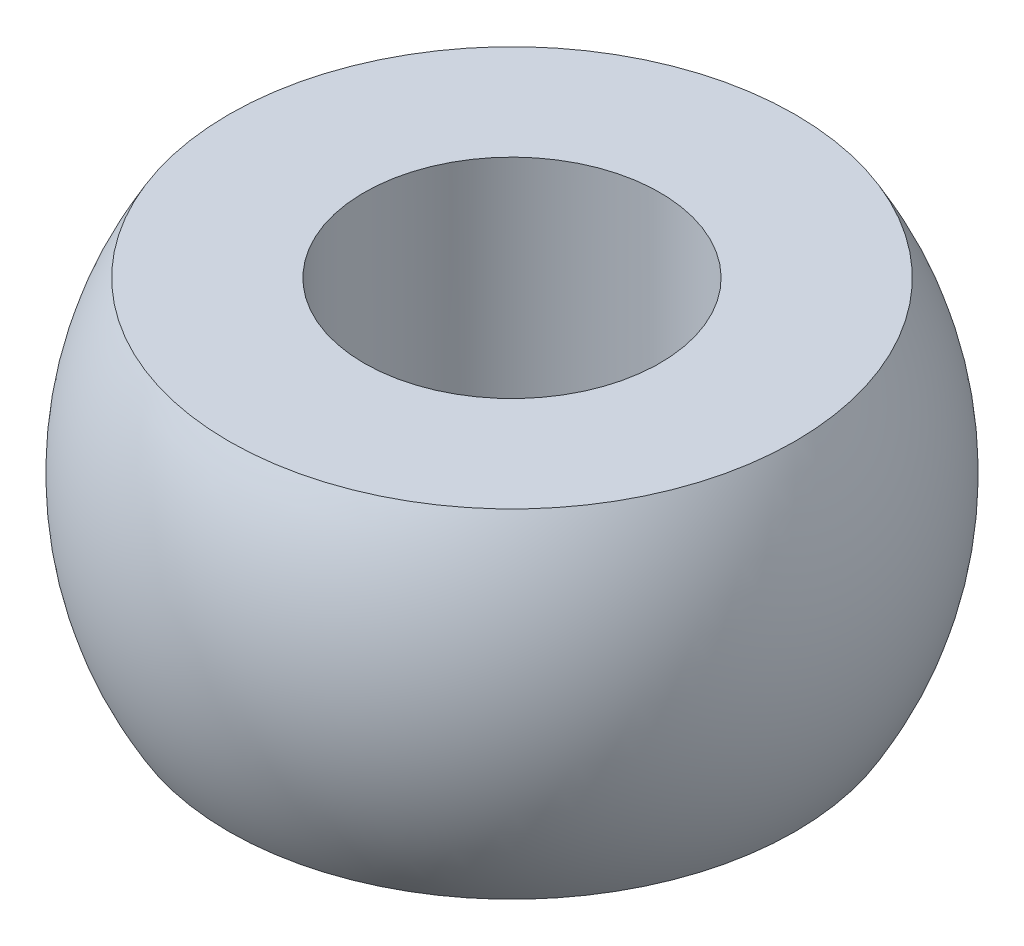
ISO-10303-21;
HEADER;
FILE_DESCRIPTION(('STEP AP214'),'2;1');
FILE_NAME('part.step','',(''),(''),'','','');
FILE_SCHEMA(('AUTOMOTIVE_DESIGN { 1 0 10303 214 1 1 1 1 }'));
ENDSEC;
DATA;
#1=APPLICATION_CONTEXT('core data for automotive mechanical design processes');
#2=APPLICATION_PROTOCOL_DEFINITION('international standard','automotive_design',2000,#1);
#3=PRODUCT_CONTEXT('',#1,'mechanical');
#4=PRODUCT('Part','Part','',(#3));
#5=PRODUCT_RELATED_PRODUCT_CATEGORY('part','',(#4));
#6=PRODUCT_DEFINITION_FORMATION('','',#4);
#7=PRODUCT_DEFINITION_CONTEXT('part definition',#1,'design');
#8=PRODUCT_DEFINITION('design','',#6,#7);
#9=PRODUCT_DEFINITION_SHAPE('','',#8);
#10=(LENGTH_UNIT() NAMED_UNIT(*) SI_UNIT(.MILLI.,.METRE.));
#11=(NAMED_UNIT(*) PLANE_ANGLE_UNIT() SI_UNIT($,.RADIAN.));
#12=(NAMED_UNIT(*) SI_UNIT($,.STERADIAN.) SOLID_ANGLE_UNIT());
#13=UNCERTAINTY_MEASURE_WITH_UNIT(LENGTH_MEASURE(1.E-05),#10,'distance_accuracy_value','');
#14=(GEOMETRIC_REPRESENTATION_CONTEXT(3) GLOBAL_UNCERTAINTY_ASSIGNED_CONTEXT((#13)) GLOBAL_UNIT_ASSIGNED_CONTEXT((#10,
#11,#12)) REPRESENTATION_CONTEXT('',''));
#15=CARTESIAN_POINT('',(0.,0.,0.));
#16=DIRECTION('',(0.,0.,1.));
#17=DIRECTION('',(1.,0.,0.));
#18=AXIS2_PLACEMENT_3D('',#15,#16,#17);
#19=CARTESIAN_POINT('',(0.,2.,0.));
#20=DIRECTION('',(0.,1.,0.));
#21=DIRECTION('',(0.,0.,1.));
#22=AXIS2_PLACEMENT_3D('',#19,#20,#21);
#23=PLANE('',#22);
#24=CARTESIAN_POINT('',(0.,2.,0.));
#25=DIRECTION('',(0.,1.,0.));
#26=DIRECTION('',(0.,0.,1.));
#27=AXIS2_PLACEMENT_3D('',#24,#25,#26);
#28=CIRCLE('',#27,1.75);
#29=CARTESIAN_POINT('',(0.,2.,1.75));
#30=VERTEX_POINT('',#29);
#31=EDGE_CURVE('E53',#30,#30,#28,.T.);
#32=ORIENTED_EDGE('',*,*,#31,.F.);
#33=EDGE_LOOP('',(#32));
#34=FACE_BOUND('',#33,.T.);
#35=CARTESIAN_POINT('',(0.,2.,0.));
#36=DIRECTION('',(0.,1.,0.));
#37=DIRECTION('',(0.,0.,1.));
#38=AXIS2_PLACEMENT_3D('',#35,#36,#37);
#39=CIRCLE('',#38,3.35);
#40=CARTESIAN_POINT('',(0.,2.,3.35));
#41=VERTEX_POINT('',#40);
#42=EDGE_CURVE('E10',#41,#41,#39,.T.);
#43=ORIENTED_EDGE('',*,*,#42,.T.);
#44=EDGE_LOOP('',(#43));
#45=FACE_BOUND('',#44,.T.);
#46=ADVANCED_FACE('F41',(#34,#45),#23,.T.);
#47=CARTESIAN_POINT('',(0.,0.,0.));
#48=DIRECTION('',(0.,1.,0.));
#49=DIRECTION('',(0.,0.,1.));
#50=AXIS2_PLACEMENT_3D('',#47,#48,#49);
#51=SPHERICAL_SURFACE('',#50,3.90160223497988);
#52=CARTESIAN_POINT('',(0.,-2.,0.));
#53=DIRECTION('',(0.,1.,0.));
#54=DIRECTION('',(0.,0.,1.));
#55=AXIS2_PLACEMENT_3D('',#52,#53,#54);
#56=CIRCLE('',#55,3.35);
#57=CARTESIAN_POINT('',(0.,-2.,3.35));
#58=VERTEX_POINT('',#57);
#59=EDGE_CURVE('E48',#58,#58,#56,.T.);
#60=CARTESIAN_POINT('',(0.,-2.,3.35));
#61=CARTESIAN_POINT('',(0.,-1.96243675523189,3.37242616582447));
#62=CARTESIAN_POINT('',(0.,-1.92449603362986,3.39422002397197));
#63=CARTESIAN_POINT('',(0.,-1.84790320020827,3.43651961537438));
#64=CARTESIAN_POINT('',(0.,-1.80925108838871,3.4570253486293));
#65=CARTESIAN_POINT('',(0.,-1.73127903798243,3.49672518070796));
#66=CARTESIAN_POINT('',(0.,-1.69195909939571,3.51591927953169));
#67=CARTESIAN_POINT('',(0.,-1.61269593020469,3.55297420780682));
#68=CARTESIAN_POINT('',(0.,-1.57275269960039,3.57083503725822));
#69=CARTESIAN_POINT('',(0.,-1.49228812856731,3.60520319575483));
#70=CARTESIAN_POINT('',(0.,-1.45176678813853,3.62171052480005));
#71=CARTESIAN_POINT('',(0.,-1.37019184924601,3.65335301092874));
#72=CARTESIAN_POINT('',(0.,-1.32913825078226,3.66848816801221));
#73=CARTESIAN_POINT('',(0.,-1.246545245692,3.69736918371475));
#74=CARTESIAN_POINT('',(0.,-1.20500583906549,3.71111504233382));
#75=CARTESIAN_POINT('',(0.,-1.12148821830909,3.73720190856192));
#76=CARTESIAN_POINT('',(0.,-1.07951000417919,3.74954291617094));
#77=CARTESIAN_POINT('',(0.,-0.995162265273221,3.77280611683498));
#78=CARTESIAN_POINT('',(0.,-0.952792740497156,3.78372830989));
#79=CARTESIAN_POINT('',(0.,-0.867710319990576,3.80414152338697));
#80=CARTESIAN_POINT('',(0.,-0.824997424260063,3.81363254382893));
#81=CARTESIAN_POINT('',(0.,-0.739276590027465,3.83117267332506));
#82=CARTESIAN_POINT('',(0.,-0.696268651525381,3.83922178237924));
#83=CARTESIAN_POINT('',(0.,-0.610006393769101,3.85386898180916));
#84=CARTESIAN_POINT('',(0.,-0.566752074514905,3.8604670721849));
#85=CARTESIAN_POINT('',(0.,-0.480045996043757,3.8722047687427));
#86=CARTESIAN_POINT('',(0.,-0.436594236826805,3.87734437492477));
#87=CARTESIAN_POINT('',(0.,-0.349542442616511,3.88615928780598));
#88=CARTESIAN_POINT('',(0.,-0.305942407623169,3.88983459450512));
#89=CARTESIAN_POINT('',(0.,-0.21864339381534,3.89571674993601));
#90=CARTESIAN_POINT('',(0.,-0.174944415000853,3.89792359866777));
#91=CARTESIAN_POINT('',(0.,-0.0874969574575782,3.9008663411897));
#92=CARTESIAN_POINT('',(0.,-0.0437484787287895,3.90160223497988));
#93=CARTESIAN_POINT('',(0.,0.0437484787287877,3.90160223497988));
#94=CARTESIAN_POINT('',(0.,0.0874969574575764,3.9008663411897));
#95=CARTESIAN_POINT('',(0.,0.174944415000851,3.89792359866777));
#96=CARTESIAN_POINT('',(0.,0.218643393815338,3.89571674993601));
#97=CARTESIAN_POINT('',(0.,0.305942407623167,3.88983459450512));
#98=CARTESIAN_POINT('',(0.,0.349542442616509,3.88615928780598));
#99=CARTESIAN_POINT('',(0.,0.436594236826803,3.87734437492477));
#100=CARTESIAN_POINT('',(0.,0.480045996043755,3.8722047687427));
#101=CARTESIAN_POINT('',(0.,0.566752074514903,3.8604670721849));
#102=CARTESIAN_POINT('',(0.,0.610006393769099,3.85386898180916));
#103=CARTESIAN_POINT('',(0.,0.69626865152538,3.83922178237924));
#104=CARTESIAN_POINT('',(0.,0.739276590027464,3.83117267332506));
#105=CARTESIAN_POINT('',(0.,0.824997424260062,3.81363254382893));
#106=CARTESIAN_POINT('',(0.,0.867710319990575,3.80414152338697));
#107=CARTESIAN_POINT('',(0.,0.952792740497154,3.78372830989));
#108=CARTESIAN_POINT('',(0.,0.99516226527322,3.77280611683498));
#109=CARTESIAN_POINT('',(0.,1.07951000417918,3.74954291617094));
#110=CARTESIAN_POINT('',(0.,1.12148821830908,3.73720190856192));
#111=CARTESIAN_POINT('',(0.,1.20500583906549,3.71111504233382));
#112=CARTESIAN_POINT('',(0.,1.246545245692,3.69736918371475));
#113=CARTESIAN_POINT('',(0.,1.32913825078226,3.66848816801221));
#114=CARTESIAN_POINT('',(0.,1.370191849246,3.65335301092874));
#115=CARTESIAN_POINT('',(0.,1.45176678813853,3.62171052480005));
#116=CARTESIAN_POINT('',(0.,1.49228812856731,3.60520319575483));
#117=CARTESIAN_POINT('',(0.,1.57275269960039,3.57083503725822));
#118=CARTESIAN_POINT('',(0.,1.61269593020469,3.55297420780682));
#119=CARTESIAN_POINT('',(0.,1.69195909939571,3.51591927953169));
#120=CARTESIAN_POINT('',(0.,1.73127903798243,3.49672518070796));
#121=CARTESIAN_POINT('',(0.,1.80925108838871,3.45702534862931));
#122=CARTESIAN_POINT('',(0.,1.84790320020827,3.43651961537438));
#123=CARTESIAN_POINT('',(0.,1.92449603362986,3.39422002397197));
#124=CARTESIAN_POINT('',(0.,1.96243675523189,3.37242616582447));
#125=CARTESIAN_POINT('',(0.,2.,3.35));
#126=B_SPLINE_CURVE_WITH_KNOTS('',3,(#60,#61,#62,#63,#64,#65,#66,#67,#68,#69,#70,#71,#72,#73,
#74,#75,#76,#77,#78,#79,#80,#81,#82,#83,#84,#85,#86,#87,#88,#89,#90,#91,#92,#93,#94,#95,#96,#97,
#98,#99,#100,#101,#102,#103,#104,#105,#106,#107,#108,#109,#110,#111,#112,#113,#114,#115,#116,
#117,#118,#119,#120,#121,#122,#123,#124,#125),.UNSPECIFIED.,.F.,.F.,(4,2,2,2,2,2,2,2,2,2,2,2,2,
2,2,2,2,2,2,2,2,2,2,2,2,2,2,2,2,2,2,2,4),(0.,0.131239249134822,0.262478498269645,
0.393717747404468,0.524956996539291,0.656196245674113,0.787435494808936,0.918674743943758,
1.04991399307858,1.1811532422134,1.31239249134823,1.44363174048305,1.57487098961787,
1.70611023875269,1.83734948788752,1.96858873702234,2.09982798615716,2.23106723529198,
2.36230648442681,2.49354573356163,2.62478498269645,2.75602423183127,2.8872634809661,
3.01850273010092,3.14974197923574,3.28098122837056,3.41222047750539,3.54345972664021,
3.67469897577503,3.80593822490985,3.93717747404468,4.0684167231795,4.19965597231432),.UNSPECIFIED.);
#127=EDGE_CURVE('BSEAM67',#58,#41,#126,.T.);
#128=ORIENTED_EDGE('',*,*,#59,.T.);
#129=ORIENTED_EDGE('',*,*,#42,.F.);
#130=ORIENTED_EDGE('',*,*,#127,.T.);
#131=ORIENTED_EDGE('',*,*,#127,.F.);
#132=EDGE_LOOP('',(#128,#130,#129,#131));
#133=FACE_BOUND('',#132,.T.);
#134=ADVANCED_FACE('F67',(#133),#51,.T.);
#135=CARTESIAN_POINT('',(0.,-2.,0.));
#136=DIRECTION('',(0.,-1.,0.));
#137=DIRECTION('',(0.,0.,-1.));
#138=AXIS2_PLACEMENT_3D('',#135,#136,#137);
#139=PLANE('',#138);
#140=CARTESIAN_POINT('',(0.,-2.,0.));
#141=DIRECTION('',(0.,-1.,0.));
#142=DIRECTION('',(0.,0.,-1.));
#143=AXIS2_PLACEMENT_3D('',#140,#141,#142);
#144=CIRCLE('',#143,1.75);
#145=CARTESIAN_POINT('',(0.,-2.,-1.75));
#146=VERTEX_POINT('',#145);
#147=EDGE_CURVE('E42',#146,#146,#144,.T.);
#148=ORIENTED_EDGE('',*,*,#147,.F.);
#149=EDGE_LOOP('',(#148));
#150=FACE_BOUND('',#149,.T.);
#151=ORIENTED_EDGE('',*,*,#59,.F.);
#152=EDGE_LOOP('',(#151));
#153=FACE_BOUND('',#152,.T.);
#154=ADVANCED_FACE('F61',(#150,#153),#139,.T.);
#155=CARTESIAN_POINT('',(0.,-8.,0.));
#156=DIRECTION('',(0.,1.,0.));
#157=DIRECTION('',(0.,0.,1.));
#158=AXIS2_PLACEMENT_3D('',#155,#156,#157);
#159=CYLINDRICAL_SURFACE('',#158,1.75);
#160=ORIENTED_EDGE('',*,*,#147,.T.);
#161=EDGE_LOOP('',(#160));
#162=FACE_BOUND('',#161,.T.);
#163=ORIENTED_EDGE('',*,*,#31,.T.);
#164=EDGE_LOOP('',(#163));
#165=FACE_BOUND('',#164,.T.);
#166=ADVANCED_FACE('F63',(#162,#165),#159,.F.);
#167=CLOSED_SHELL('',(#46,#134,#154,#166));
#168=MANIFOLD_SOLID_BREP('B2',#167);
#169=ADVANCED_BREP_SHAPE_REPRESENTATION('',(#18,#168),#14);
#170=SHAPE_DEFINITION_REPRESENTATION(#9,#169);
ENDSEC;
END-ISO-10303-21;
